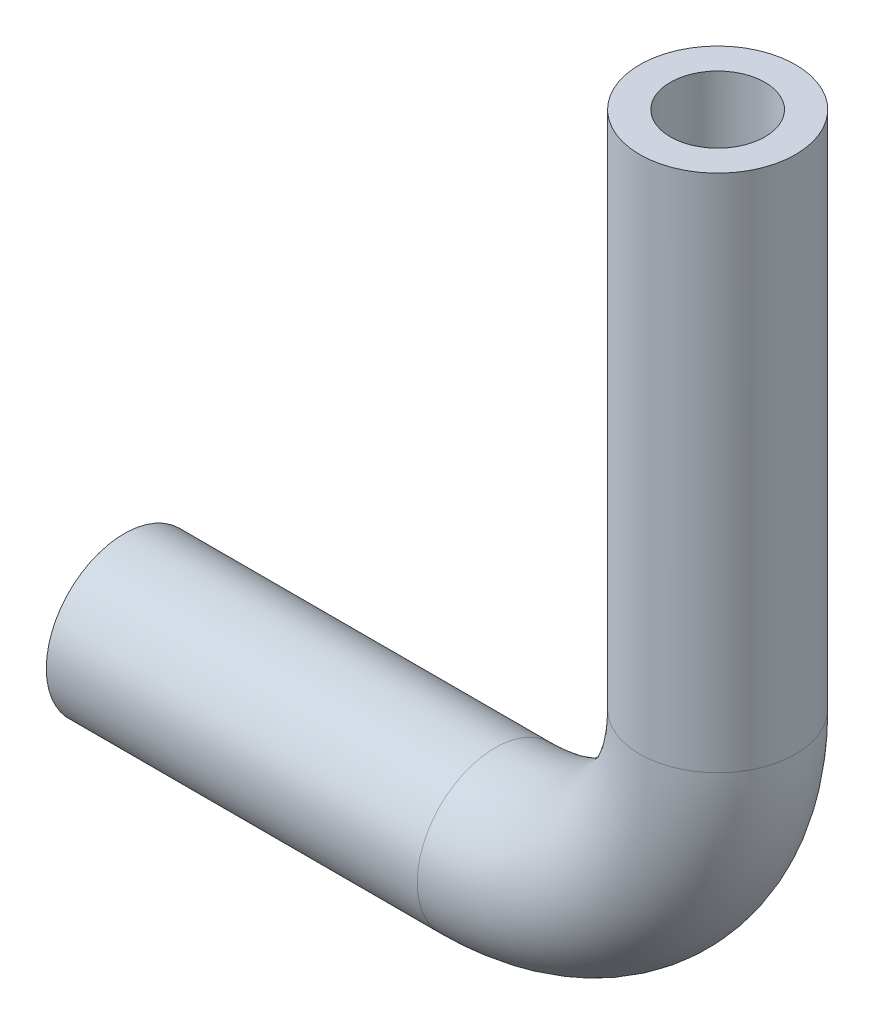
ISO-10303-21;
HEADER;
FILE_DESCRIPTION(('STEP AP214'),'2;1');
FILE_NAME('part.step','',(''),(''),'','','');
FILE_SCHEMA(('AUTOMOTIVE_DESIGN { 1 0 10303 214 1 1 1 1 }'));
ENDSEC;
DATA;
#1=APPLICATION_CONTEXT('core data for automotive mechanical design processes');
#2=APPLICATION_PROTOCOL_DEFINITION('international standard','automotive_design',2000,#1);
#3=PRODUCT_CONTEXT('',#1,'mechanical');
#4=PRODUCT('Part','Part','',(#3));
#5=PRODUCT_RELATED_PRODUCT_CATEGORY('part','',(#4));
#6=PRODUCT_DEFINITION_FORMATION('','',#4);
#7=PRODUCT_DEFINITION_CONTEXT('part definition',#1,'design');
#8=PRODUCT_DEFINITION('design','',#6,#7);
#9=PRODUCT_DEFINITION_SHAPE('','',#8);
#10=(LENGTH_UNIT() NAMED_UNIT(*) SI_UNIT(.MILLI.,.METRE.));
#11=(NAMED_UNIT(*) PLANE_ANGLE_UNIT() SI_UNIT($,.RADIAN.));
#12=(NAMED_UNIT(*) SI_UNIT($,.STERADIAN.) SOLID_ANGLE_UNIT());
#13=UNCERTAINTY_MEASURE_WITH_UNIT(LENGTH_MEASURE(1.E-05),#10,'distance_accuracy_value','');
#14=(GEOMETRIC_REPRESENTATION_CONTEXT(3) GLOBAL_UNCERTAINTY_ASSIGNED_CONTEXT((#13)) GLOBAL_UNIT_ASSIGNED_CONTEXT((#10,
#11,#12)) REPRESENTATION_CONTEXT('',''));
#15=CARTESIAN_POINT('',(0.,0.,0.));
#16=DIRECTION('',(0.,0.,1.));
#17=DIRECTION('',(1.,0.,0.));
#18=AXIS2_PLACEMENT_3D('',#15,#16,#17);
#19=CARTESIAN_POINT('',(0.,0.,0.));
#20=DIRECTION('',(0.,-1.,0.));
#21=DIRECTION('',(1.,0.,0.));
#22=AXIS2_PLACEMENT_3D('',#19,#20,#21);
#23=CYLINDRICAL_SURFACE('',#22,10.5);
#24=CARTESIAN_POINT('',(0.,-70.,0.));
#25=DIRECTION('',(0.,1.,0.));
#26=DIRECTION('',(0.,0.,1.));
#27=AXIS2_PLACEMENT_3D('',#24,#25,#26);
#28=CIRCLE('',#27,10.5);
#29=CARTESIAN_POINT('',(10.5,-70.,0.));
#30=VERTEX_POINT('',#29);
#31=EDGE_CURVE('E98',#30,#30,#28,.T.);
#32=ORIENTED_EDGE('',*,*,#31,.T.);
#33=EDGE_LOOP('',(#32));
#34=FACE_BOUND('',#33,.T.);
#35=CARTESIAN_POINT('',(0.,0.,0.));
#36=DIRECTION('',(0.,1.,0.));
#37=DIRECTION('',(0.,0.,1.));
#38=AXIS2_PLACEMENT_3D('',#35,#36,#37);
#39=CIRCLE('',#38,10.5);
#40=CARTESIAN_POINT('',(0.,0.,10.5));
#41=VERTEX_POINT('',#40);
#42=EDGE_CURVE('E47',#41,#41,#39,.T.);
#43=ORIENTED_EDGE('',*,*,#42,.F.);
#44=EDGE_LOOP('',(#43));
#45=FACE_BOUND('',#44,.T.);
#46=ADVANCED_FACE('F32',(#34,#45),#23,.T.);
#47=CARTESIAN_POINT('',(-30.,-70.,0.));
#48=DIRECTION('',(0.,0.,-1.));
#49=DIRECTION('',(-1.,0.,0.));
#50=AXIS2_PLACEMENT_3D('',#47,#48,#49);
#51=TOROIDAL_SURFACE('',#50,30.,10.5);
#52=CARTESIAN_POINT('',(-30.,-100.,0.));
#53=DIRECTION('',(1.,0.,0.));
#54=DIRECTION('',(0.,0.,1.));
#55=AXIS2_PLACEMENT_3D('',#52,#53,#54);
#56=CIRCLE('',#55,10.5);
#57=CARTESIAN_POINT('',(-30.,-110.5,0.));
#58=VERTEX_POINT('',#57);
#59=EDGE_CURVE('E36',#58,#58,#56,.T.);
#60=CARTESIAN_POINT('',(-30.,-70.,0.));
#61=DIRECTION('',(0.,0.,-1.));
#62=DIRECTION('',(-1.,0.,0.));
#63=AXIS2_PLACEMENT_3D('',#60,#61,#62);
#64=CIRCLE('',#63,40.5);
#65=EDGE_CURVE('',#30,#58,#64,.T.);
#66=ORIENTED_EDGE('',*,*,#31,.F.);
#67=ORIENTED_EDGE('',*,*,#59,.T.);
#68=ORIENTED_EDGE('',*,*,#65,.T.);
#69=ORIENTED_EDGE('',*,*,#65,.F.);
#70=EDGE_LOOP('',(#66,#68,#67,#69));
#71=FACE_BOUND('',#70,.T.);
#72=ADVANCED_FACE('F105',(#71),#51,.T.);
#73=CARTESIAN_POINT('',(-30.,-100.,0.));
#74=DIRECTION('',(-1.,0.,0.));
#75=DIRECTION('',(0.,-1.,0.));
#76=AXIS2_PLACEMENT_3D('',#73,#74,#75);
#77=CYLINDRICAL_SURFACE('',#76,10.5);
#78=CARTESIAN_POINT('',(-80.,-100.,0.));
#79=DIRECTION('',(1.,0.,0.));
#80=DIRECTION('',(0.,0.,1.));
#81=AXIS2_PLACEMENT_3D('',#78,#79,#80);
#82=CIRCLE('',#81,10.5);
#83=CARTESIAN_POINT('',(-80.,-100.,10.5));
#84=VERTEX_POINT('',#83);
#85=EDGE_CURVE('E52',#84,#84,#82,.T.);
#86=ORIENTED_EDGE('',*,*,#85,.T.);
#87=EDGE_LOOP('',(#86));
#88=FACE_BOUND('',#87,.T.);
#89=ORIENTED_EDGE('',*,*,#59,.F.);
#90=EDGE_LOOP('',(#89));
#91=FACE_BOUND('',#90,.T.);
#92=ADVANCED_FACE('F34',(#88,#91),#77,.T.);
#93=CARTESIAN_POINT('',(0.,0.,0.));
#94=DIRECTION('',(0.,1.,0.));
#95=DIRECTION('',(0.,0.,1.));
#96=AXIS2_PLACEMENT_3D('',#93,#94,#95);
#97=PLANE('',#96);
#98=CARTESIAN_POINT('',(0.,0.,0.));
#99=DIRECTION('',(0.,1.,0.));
#100=DIRECTION('',(0.,0.,1.));
#101=AXIS2_PLACEMENT_3D('',#98,#99,#100);
#102=CIRCLE('',#101,6.375);
#103=CARTESIAN_POINT('',(0.,0.,6.375));
#104=VERTEX_POINT('',#103);
#105=EDGE_CURVE('E91',#104,#104,#102,.F.);
#106=ORIENTED_EDGE('',*,*,#105,.T.);
#107=EDGE_LOOP('',(#106));
#108=FACE_BOUND('',#107,.T.);
#109=ORIENTED_EDGE('',*,*,#42,.T.);
#110=EDGE_LOOP('',(#109));
#111=FACE_BOUND('',#110,.T.);
#112=ADVANCED_FACE('F65',(#108,#111),#97,.T.);
#113=CARTESIAN_POINT('',(-80.,-100.,0.));
#114=DIRECTION('',(1.,0.,0.));
#115=DIRECTION('',(0.,0.,1.));
#116=AXIS2_PLACEMENT_3D('',#113,#114,#115);
#117=PLANE('',#116);
#118=CARTESIAN_POINT('',(-80.,-100.,0.));
#119=DIRECTION('',(1.,0.,0.));
#120=DIRECTION('',(0.,0.,1.));
#121=AXIS2_PLACEMENT_3D('',#118,#119,#120);
#122=CIRCLE('',#121,6.375);
#123=CARTESIAN_POINT('',(-80.,-100.,6.375));
#124=VERTEX_POINT('',#123);
#125=EDGE_CURVE('E11',#124,#124,#122,.F.);
#126=ORIENTED_EDGE('',*,*,#125,.F.);
#127=EDGE_LOOP('',(#126));
#128=FACE_BOUND('',#127,.T.);
#129=ORIENTED_EDGE('',*,*,#85,.F.);
#130=EDGE_LOOP('',(#129));
#131=FACE_BOUND('',#130,.T.);
#132=ADVANCED_FACE('F62',(#128,#131),#117,.F.);
#133=CARTESIAN_POINT('',(0.,0.,0.));
#134=DIRECTION('',(0.,-1.,0.));
#135=DIRECTION('',(1.,0.,0.));
#136=AXIS2_PLACEMENT_3D('',#133,#134,#135);
#137=CYLINDRICAL_SURFACE('',#136,6.375);
#138=CARTESIAN_POINT('',(0.,-70.,0.));
#139=DIRECTION('',(0.,1.,0.));
#140=DIRECTION('',(0.,0.,1.));
#141=AXIS2_PLACEMENT_3D('',#138,#139,#140);
#142=CIRCLE('',#141,6.375);
#143=CARTESIAN_POINT('',(6.37500000000001,-70.,0.));
#144=VERTEX_POINT('',#143);
#145=EDGE_CURVE('E90',#144,#144,#142,.F.);
#146=ORIENTED_EDGE('',*,*,#145,.T.);
#147=EDGE_LOOP('',(#146));
#148=FACE_BOUND('',#147,.T.);
#149=ORIENTED_EDGE('',*,*,#105,.F.);
#150=EDGE_LOOP('',(#149));
#151=FACE_BOUND('',#150,.T.);
#152=ADVANCED_FACE('F64',(#148,#151),#137,.F.);
#153=CARTESIAN_POINT('',(-30.,-70.,0.));
#154=DIRECTION('',(0.,0.,-1.));
#155=DIRECTION('',(-1.,0.,0.));
#156=AXIS2_PLACEMENT_3D('',#153,#154,#155);
#157=TOROIDAL_SURFACE('',#156,30.,6.375);
#158=CARTESIAN_POINT('',(-30.,-100.,0.));
#159=DIRECTION('',(1.,0.,0.));
#160=DIRECTION('',(0.,0.,1.));
#161=AXIS2_PLACEMENT_3D('',#158,#159,#160);
#162=CIRCLE('',#161,6.375);
#163=CARTESIAN_POINT('',(-30.,-106.375,0.));
#164=VERTEX_POINT('',#163);
#165=EDGE_CURVE('E41',#164,#164,#162,.F.);
#166=CARTESIAN_POINT('',(-30.,-70.,0.));
#167=DIRECTION('',(0.,0.,-1.));
#168=DIRECTION('',(-1.,0.,0.));
#169=AXIS2_PLACEMENT_3D('',#166,#167,#168);
#170=CIRCLE('',#169,36.375);
#171=EDGE_CURVE('',#144,#164,#170,.T.);
#172=ORIENTED_EDGE('',*,*,#145,.F.);
#173=ORIENTED_EDGE('',*,*,#165,.T.);
#174=ORIENTED_EDGE('',*,*,#171,.T.);
#175=ORIENTED_EDGE('',*,*,#171,.F.);
#176=EDGE_LOOP('',(#172,#174,#173,#175));
#177=FACE_BOUND('',#176,.T.);
#178=ADVANCED_FACE('F71',(#177),#157,.F.);
#179=CARTESIAN_POINT('',(-30.,-100.,0.));
#180=DIRECTION('',(-1.,0.,0.));
#181=DIRECTION('',(0.,-1.,0.));
#182=AXIS2_PLACEMENT_3D('',#179,#180,#181);
#183=CYLINDRICAL_SURFACE('',#182,6.375);
#184=ORIENTED_EDGE('',*,*,#125,.T.);
#185=EDGE_LOOP('',(#184));
#186=FACE_BOUND('',#185,.T.);
#187=ORIENTED_EDGE('',*,*,#165,.F.);
#188=EDGE_LOOP('',(#187));
#189=FACE_BOUND('',#188,.T.);
#190=ADVANCED_FACE('F59',(#186,#189),#183,.F.);
#191=CLOSED_SHELL('',(#46,#72,#92,#112,#132,#152,#178,#190));
#192=MANIFOLD_SOLID_BREP('B2',#191);
#193=ADVANCED_BREP_SHAPE_REPRESENTATION('',(#18,#192),#14);
#194=SHAPE_DEFINITION_REPRESENTATION(#9,#193);
ENDSEC;
END-ISO-10303-21;
